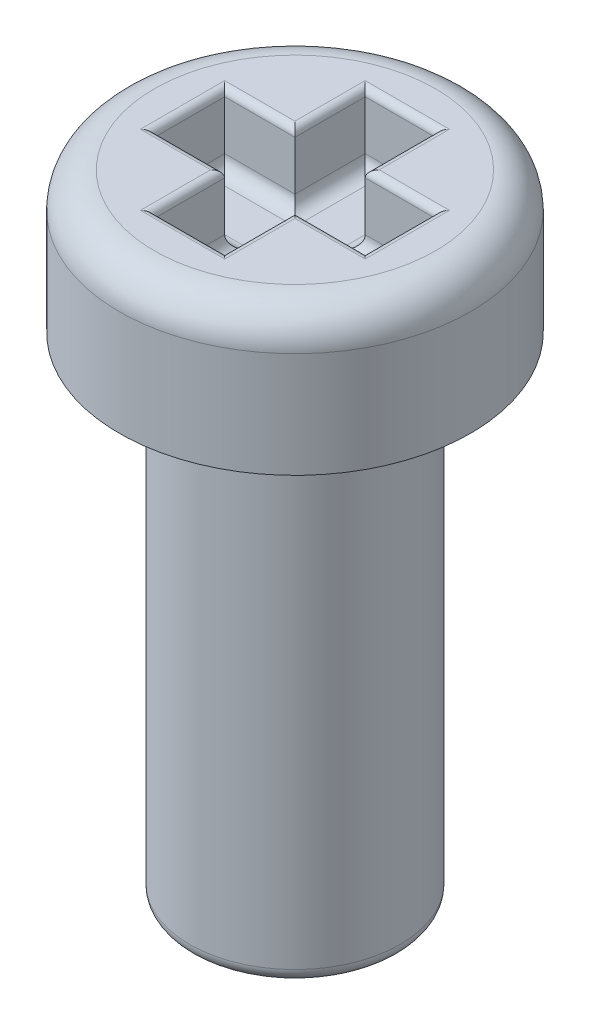
ISO-10303-21;
HEADER;
FILE_DESCRIPTION(('STEP AP214'),'2;1');
FILE_NAME('part.step','',(''),(''),'','','');
FILE_SCHEMA(('AUTOMOTIVE_DESIGN { 1 0 10303 214 1 1 1 1 }'));
ENDSEC;
DATA;
#1=APPLICATION_CONTEXT('core data for automotive mechanical design processes');
#2=APPLICATION_PROTOCOL_DEFINITION('international standard','automotive_design',2000,#1);
#3=PRODUCT_CONTEXT('',#1,'mechanical');
#4=PRODUCT('Part','Part','',(#3));
#5=PRODUCT_RELATED_PRODUCT_CATEGORY('part','',(#4));
#6=PRODUCT_DEFINITION_FORMATION('','',#4);
#7=PRODUCT_DEFINITION_CONTEXT('part definition',#1,'design');
#8=PRODUCT_DEFINITION('design','',#6,#7);
#9=PRODUCT_DEFINITION_SHAPE('','',#8);
#10=(LENGTH_UNIT() NAMED_UNIT(*) SI_UNIT(.MILLI.,.METRE.));
#11=(NAMED_UNIT(*) PLANE_ANGLE_UNIT() SI_UNIT($,.RADIAN.));
#12=(NAMED_UNIT(*) SI_UNIT($,.STERADIAN.) SOLID_ANGLE_UNIT());
#13=UNCERTAINTY_MEASURE_WITH_UNIT(LENGTH_MEASURE(1.E-05),#10,'distance_accuracy_value','');
#14=(GEOMETRIC_REPRESENTATION_CONTEXT(3) GLOBAL_UNCERTAINTY_ASSIGNED_CONTEXT((#13)) GLOBAL_UNIT_ASSIGNED_CONTEXT((#10,
#11,#12)) REPRESENTATION_CONTEXT('',''));
#15=CARTESIAN_POINT('',(0.,0.,0.));
#16=DIRECTION('',(0.,0.,1.));
#17=DIRECTION('',(1.,0.,0.));
#18=AXIS2_PLACEMENT_3D('',#15,#16,#17);
#19=CARTESIAN_POINT('',(0.,7.,0.));
#20=DIRECTION('',(0.,-1.,0.));
#21=DIRECTION('',(0.,0.,-1.));
#22=AXIS2_PLACEMENT_3D('',#19,#20,#21);
#23=CYLINDRICAL_SURFACE('',#22,1.5);
#24=CARTESIAN_POINT('',(0.,0.2,0.));
#25=DIRECTION('',(0.,1.,0.));
#26=DIRECTION('',(0.,0.,1.));
#27=AXIS2_PLACEMENT_3D('',#24,#25,#26);
#28=CIRCLE('',#27,1.5);
#29=CARTESIAN_POINT('',(0.,0.2,1.5));
#30=VERTEX_POINT('',#29);
#31=EDGE_CURVE('E245',#30,#30,#28,.T.);
#32=ORIENTED_EDGE('',*,*,#31,.T.);
#33=EDGE_LOOP('',(#32));
#34=FACE_BOUND('',#33,.T.);
#35=CARTESIAN_POINT('',(0.,7.,0.));
#36=DIRECTION('',(0.,1.,0.));
#37=DIRECTION('',(0.,0.,1.));
#38=AXIS2_PLACEMENT_3D('',#35,#36,#37);
#39=CIRCLE('',#38,1.5);
#40=CARTESIAN_POINT('',(0.,7.,1.5));
#41=VERTEX_POINT('',#40);
#42=EDGE_CURVE('E549',#41,#41,#39,.T.);
#43=ORIENTED_EDGE('',*,*,#42,.F.);
#44=EDGE_LOOP('',(#43));
#45=FACE_BOUND('',#44,.T.);
#46=ADVANCED_FACE('F39',(#34,#45),#23,.T.);
#47=CARTESIAN_POINT('',(0.,0.,0.));
#48=DIRECTION('',(0.,1.,0.));
#49=DIRECTION('',(0.,0.,1.));
#50=AXIS2_PLACEMENT_3D('',#47,#48,#49);
#51=PLANE('',#50);
#52=CARTESIAN_POINT('',(0.,0.,0.));
#53=DIRECTION('',(0.,1.,0.));
#54=DIRECTION('',(0.,0.,1.));
#55=AXIS2_PLACEMENT_3D('',#52,#53,#54);
#56=CIRCLE('',#55,1.3);
#57=CARTESIAN_POINT('',(0.,0.,1.3));
#58=VERTEX_POINT('',#57);
#59=EDGE_CURVE('E240',#58,#58,#56,.F.);
#60=ORIENTED_EDGE('',*,*,#59,.T.);
#61=EDGE_LOOP('',(#60));
#62=FACE_BOUND('',#61,.T.);
#63=ADVANCED_FACE('F424',(#62),#51,.F.);
#64=CARTESIAN_POINT('',(0.,0.2,0.));
#65=DIRECTION('',(0.,1.,0.));
#66=DIRECTION('',(0.,0.,1.));
#67=AXIS2_PLACEMENT_3D('',#64,#65,#66);
#68=TOROIDAL_SURFACE('',#67,1.3,0.2);
#69=ORIENTED_EDGE('',*,*,#59,.F.);
#70=EDGE_LOOP('',(#69));
#71=FACE_BOUND('',#70,.T.);
#72=ORIENTED_EDGE('',*,*,#31,.F.);
#73=EDGE_LOOP('',(#72));
#74=FACE_BOUND('',#73,.T.);
#75=ADVANCED_FACE('F430',(#71,#74),#68,.T.);
#76=CARTESIAN_POINT('',(0.,7.,0.));
#77=DIRECTION('',(0.,1.,0.));
#78=DIRECTION('',(0.,0.,1.));
#79=AXIS2_PLACEMENT_3D('',#76,#77,#78);
#80=PLANE('',#79);
#81=ORIENTED_EDGE('',*,*,#42,.T.);
#82=EDGE_LOOP('',(#81));
#83=FACE_BOUND('',#82,.T.);
#84=CARTESIAN_POINT('',(0.,7.,0.));
#85=DIRECTION('',(0.,-1.,0.));
#86=DIRECTION('',(0.,0.,-1.));
#87=AXIS2_PLACEMENT_3D('',#84,#85,#86);
#88=CIRCLE('',#87,2.5);
#89=CARTESIAN_POINT('',(0.,7.,-2.5));
#90=VERTEX_POINT('',#89);
#91=EDGE_CURVE('E546',#90,#90,#88,.T.);
#92=ORIENTED_EDGE('',*,*,#91,.T.);
#93=EDGE_LOOP('',(#92));
#94=FACE_BOUND('',#93,.T.);
#95=ADVANCED_FACE('F439',(#83,#94),#80,.F.);
#96=CARTESIAN_POINT('',(0.,0.,0.));
#97=DIRECTION('',(0.,-1.,0.));
#98=DIRECTION('',(0.,0.,-1.));
#99=AXIS2_PLACEMENT_3D('',#96,#97,#98);
#100=CYLINDRICAL_SURFACE('',#99,2.5);
#101=CARTESIAN_POINT('',(0.,8.5,0.));
#102=DIRECTION('',(0.,-1.,0.));
#103=DIRECTION('',(0.,0.,-1.));
#104=AXIS2_PLACEMENT_3D('',#101,#102,#103);
#105=CIRCLE('',#104,2.5);
#106=CARTESIAN_POINT('',(0.,8.5,-2.5));
#107=VERTEX_POINT('',#106);
#108=EDGE_CURVE('E47',#107,#107,#105,.T.);
#109=ORIENTED_EDGE('',*,*,#108,.T.);
#110=EDGE_LOOP('',(#109));
#111=FACE_BOUND('',#110,.T.);
#112=ORIENTED_EDGE('',*,*,#91,.F.);
#113=EDGE_LOOP('',(#112));
#114=FACE_BOUND('',#113,.T.);
#115=ADVANCED_FACE('F409',(#111,#114),#100,.T.);
#116=CARTESIAN_POINT('',(-2.5,9.,0.));
#117=DIRECTION('',(0.,-1.,0.));
#118=DIRECTION('',(0.,0.,-1.));
#119=AXIS2_PLACEMENT_3D('',#116,#117,#118);
#120=PLANE('',#119);
#121=CARTESIAN_POINT('',(0.,9.,0.));
#122=DIRECTION('',(0.,-1.,0.));
#123=DIRECTION('',(0.,0.,-1.));
#124=AXIS2_PLACEMENT_3D('',#121,#122,#123);
#125=CIRCLE('',#124,2.);
#126=CARTESIAN_POINT('',(0.,9.,-2.));
#127=VERTEX_POINT('',#126);
#128=EDGE_CURVE('E11',#127,#127,#125,.F.);
#129=ORIENTED_EDGE('',*,*,#128,.T.);
#130=EDGE_LOOP('',(#129));
#131=FACE_BOUND('',#130,.T.);
#132=DIRECTION('',(0.,0.,1.));
#133=VECTOR('',#132,1.);
#134=CARTESIAN_POINT('',(-0.6,9.,0.));
#135=LINE('',#134,#133);
#136=CARTESIAN_POINT('',(-0.6,9.,1.6));
#137=VERTEX_POINT('',#136);
#138=CARTESIAN_POINT('',(-0.6,9.,0.6));
#139=VERTEX_POINT('',#138);
#140=EDGE_CURVE('E266',#137,#139,#135,.F.);
#141=ORIENTED_EDGE('',*,*,#140,.T.);
#142=DIRECTION('',(1.,0.,0.));
#143=VECTOR('',#142,1.);
#144=CARTESIAN_POINT('',(-2.5,9.,0.6));
#145=LINE('',#144,#143);
#146=CARTESIAN_POINT('',(-1.6,9.,0.6));
#147=VERTEX_POINT('',#146);
#148=EDGE_CURVE('E224',#139,#147,#145,.F.);
#149=ORIENTED_EDGE('',*,*,#148,.T.);
#150=DIRECTION('',(0.,0.,1.));
#151=VECTOR('',#150,1.);
#152=CARTESIAN_POINT('',(-1.6,9.,0.));
#153=LINE('',#152,#151);
#154=CARTESIAN_POINT('',(-1.6,9.,-0.6));
#155=VERTEX_POINT('',#154);
#156=EDGE_CURVE('E239',#147,#155,#153,.F.);
#157=ORIENTED_EDGE('',*,*,#156,.T.);
#158=DIRECTION('',(-1.,0.,0.));
#159=VECTOR('',#158,1.);
#160=CARTESIAN_POINT('',(-2.5,9.,-0.6));
#161=LINE('',#160,#159);
#162=CARTESIAN_POINT('',(-0.6,9.,-0.6));
#163=VERTEX_POINT('',#162);
#164=EDGE_CURVE('E242',#155,#163,#161,.F.);
#165=ORIENTED_EDGE('',*,*,#164,.T.);
#166=DIRECTION('',(0.,0.,1.));
#167=VECTOR('',#166,1.);
#168=CARTESIAN_POINT('',(-0.6,9.,0.));
#169=LINE('',#168,#167);
#170=CARTESIAN_POINT('',(-0.6,9.,-1.6));
#171=VERTEX_POINT('',#170);
#172=EDGE_CURVE('E250',#163,#171,#169,.F.);
#173=ORIENTED_EDGE('',*,*,#172,.T.);
#174=DIRECTION('',(-1.,0.,0.));
#175=VECTOR('',#174,1.);
#176=CARTESIAN_POINT('',(-2.5,9.,-1.6));
#177=LINE('',#176,#175);
#178=CARTESIAN_POINT('',(0.6,9.,-1.6));
#179=VERTEX_POINT('',#178);
#180=EDGE_CURVE('E252',#171,#179,#177,.F.);
#181=ORIENTED_EDGE('',*,*,#180,.T.);
#182=DIRECTION('',(0.,0.,-1.));
#183=VECTOR('',#182,1.);
#184=CARTESIAN_POINT('',(0.6,9.,0.));
#185=LINE('',#184,#183);
#186=CARTESIAN_POINT('',(0.6,9.,-0.6));
#187=VERTEX_POINT('',#186);
#188=EDGE_CURVE('E254',#179,#187,#185,.F.);
#189=ORIENTED_EDGE('',*,*,#188,.T.);
#190=DIRECTION('',(-1.,0.,0.));
#191=VECTOR('',#190,1.);
#192=CARTESIAN_POINT('',(-2.5,9.,-0.599999999999999));
#193=LINE('',#192,#191);
#194=CARTESIAN_POINT('',(1.6,9.,-0.6));
#195=VERTEX_POINT('',#194);
#196=EDGE_CURVE('E256',#187,#195,#193,.F.);
#197=ORIENTED_EDGE('',*,*,#196,.T.);
#198=DIRECTION('',(0.,0.,-1.));
#199=VECTOR('',#198,1.);
#200=CARTESIAN_POINT('',(1.6,9.,0.));
#201=LINE('',#200,#199);
#202=CARTESIAN_POINT('',(1.6,9.,0.6));
#203=VERTEX_POINT('',#202);
#204=EDGE_CURVE('E258',#195,#203,#201,.F.);
#205=ORIENTED_EDGE('',*,*,#204,.T.);
#206=DIRECTION('',(1.,0.,0.));
#207=VECTOR('',#206,1.);
#208=CARTESIAN_POINT('',(-2.5,9.,0.6));
#209=LINE('',#208,#207);
#210=CARTESIAN_POINT('',(0.6,9.,0.6));
#211=VERTEX_POINT('',#210);
#212=EDGE_CURVE('E260',#203,#211,#209,.F.);
#213=ORIENTED_EDGE('',*,*,#212,.T.);
#214=DIRECTION('',(0.,0.,-1.));
#215=VECTOR('',#214,1.);
#216=CARTESIAN_POINT('',(0.6,9.,0.));
#217=LINE('',#216,#215);
#218=CARTESIAN_POINT('',(0.6,9.,1.6));
#219=VERTEX_POINT('',#218);
#220=EDGE_CURVE('E262',#211,#219,#217,.F.);
#221=ORIENTED_EDGE('',*,*,#220,.T.);
#222=DIRECTION('',(1.,0.,0.));
#223=VECTOR('',#222,1.);
#224=CARTESIAN_POINT('',(-2.5,9.,1.6));
#225=LINE('',#224,#223);
#226=EDGE_CURVE('E264',#219,#137,#225,.F.);
#227=ORIENTED_EDGE('',*,*,#226,.T.);
#228=EDGE_LOOP('',(#141,#149,#157,#165,#173,#181,#189,#197,#205,#213,#221,#227));
#229=FACE_BOUND('',#228,.T.);
#230=ADVANCED_FACE('F578',(#131,#229),#120,.F.);
#231=CARTESIAN_POINT('',(0.5,8.,0.5));
#232=DIRECTION('',(1.,0.,0.));
#233=DIRECTION('',(0.,0.,-1.));
#234=AXIS2_PLACEMENT_3D('',#231,#232,#233);
#235=PLANE('',#234);
#236=DIRECTION('',(0.,1.,0.));
#237=VECTOR('',#236,1.);
#238=CARTESIAN_POINT('',(0.5,8.,0.5));
#239=LINE('',#238,#237);
#240=CARTESIAN_POINT('',(0.5,8.2,0.5));
#241=VERTEX_POINT('',#240);
#242=CARTESIAN_POINT('',(0.5,8.9,0.5));
#243=VERTEX_POINT('',#242);
#244=EDGE_CURVE('E327',#241,#243,#239,.T.);
#245=ORIENTED_EDGE('',*,*,#244,.F.);
#246=DIRECTION('',(0.,0.,-1.));
#247=VECTOR('',#246,1.);
#248=CARTESIAN_POINT('',(0.5,8.2,0.5));
#249=LINE('',#248,#247);
#250=CARTESIAN_POINT('',(0.5,8.2,1.5));
#251=VERTEX_POINT('',#250);
#252=EDGE_CURVE('E360',#241,#251,#249,.F.);
#253=ORIENTED_EDGE('',*,*,#252,.T.);
#254=DIRECTION('',(0.,1.,0.));
#255=VECTOR('',#254,1.);
#256=CARTESIAN_POINT('',(0.5,8.,1.5));
#257=LINE('',#256,#255);
#258=CARTESIAN_POINT('',(0.5,8.9,1.5));
#259=VERTEX_POINT('',#258);
#260=EDGE_CURVE('E542',#251,#259,#257,.T.);
#261=ORIENTED_EDGE('',*,*,#260,.T.);
#262=DIRECTION('',(0.,0.,-1.));
#263=VECTOR('',#262,1.);
#264=CARTESIAN_POINT('',(0.5,8.9,0.5));
#265=LINE('',#264,#263);
#266=EDGE_CURVE('E271',#259,#243,#265,.T.);
#267=ORIENTED_EDGE('',*,*,#266,.T.);
#268=EDGE_LOOP('',(#245,#253,#261,#267));
#269=FACE_BOUND('',#268,.T.);
#270=ADVANCED_FACE('F541',(#269),#235,.F.);
#271=CARTESIAN_POINT('',(-0.5,8.,1.5));
#272=DIRECTION('',(0.,0.,1.));
#273=DIRECTION('',(1.,0.,0.));
#274=AXIS2_PLACEMENT_3D('',#271,#272,#273);
#275=PLANE('',#274);
#276=ORIENTED_EDGE('',*,*,#260,.F.);
#277=DIRECTION('',(1.,0.,0.));
#278=VECTOR('',#277,1.);
#279=CARTESIAN_POINT('',(-0.5,8.2,1.5));
#280=LINE('',#279,#278);
#281=CARTESIAN_POINT('',(-0.5,8.2,1.5));
#282=VERTEX_POINT('',#281);
#283=EDGE_CURVE('E362',#251,#282,#280,.F.);
#284=ORIENTED_EDGE('',*,*,#283,.T.);
#285=DIRECTION('',(0.,1.,0.));
#286=VECTOR('',#285,1.);
#287=CARTESIAN_POINT('',(-0.5,8.,1.5));
#288=LINE('',#287,#286);
#289=CARTESIAN_POINT('',(-0.5,8.9,1.5));
#290=VERTEX_POINT('',#289);
#291=EDGE_CURVE('E213',#282,#290,#288,.T.);
#292=ORIENTED_EDGE('',*,*,#291,.T.);
#293=DIRECTION('',(1.,0.,0.));
#294=VECTOR('',#293,1.);
#295=CARTESIAN_POINT('',(-0.5,8.9,1.5));
#296=LINE('',#295,#294);
#297=EDGE_CURVE('E234',#290,#259,#296,.T.);
#298=ORIENTED_EDGE('',*,*,#297,.T.);
#299=EDGE_LOOP('',(#276,#284,#292,#298));
#300=FACE_BOUND('',#299,.T.);
#301=ADVANCED_FACE('F544',(#300),#275,.F.);
#302=CARTESIAN_POINT('',(-0.5,8.,0.5));
#303=DIRECTION('',(-1.,0.,0.));
#304=DIRECTION('',(0.,0.,1.));
#305=AXIS2_PLACEMENT_3D('',#302,#303,#304);
#306=PLANE('',#305);
#307=ORIENTED_EDGE('',*,*,#291,.F.);
#308=DIRECTION('',(0.,0.,1.));
#309=VECTOR('',#308,1.);
#310=CARTESIAN_POINT('',(-0.5,8.2,0.5));
#311=LINE('',#310,#309);
#312=CARTESIAN_POINT('',(-0.5,8.2,0.5));
#313=VERTEX_POINT('',#312);
#314=EDGE_CURVE('E209',#282,#313,#311,.F.);
#315=ORIENTED_EDGE('',*,*,#314,.T.);
#316=DIRECTION('',(0.,1.,0.));
#317=VECTOR('',#316,1.);
#318=CARTESIAN_POINT('',(-0.5,8.,0.5));
#319=LINE('',#318,#317);
#320=CARTESIAN_POINT('',(-0.5,8.9,0.5));
#321=VERTEX_POINT('',#320);
#322=EDGE_CURVE('E201',#313,#321,#319,.T.);
#323=ORIENTED_EDGE('',*,*,#322,.T.);
#324=DIRECTION('',(0.,0.,1.));
#325=VECTOR('',#324,1.);
#326=CARTESIAN_POINT('',(-0.5,8.9,0.5));
#327=LINE('',#326,#325);
#328=EDGE_CURVE('E206',#321,#290,#327,.T.);
#329=ORIENTED_EDGE('',*,*,#328,.T.);
#330=EDGE_LOOP('',(#307,#315,#323,#329));
#331=FACE_BOUND('',#330,.T.);
#332=ADVANCED_FACE('F204',(#331),#306,.F.);
#333=CARTESIAN_POINT('',(-0.5,8.,0.5));
#334=DIRECTION('',(0.,0.,1.));
#335=DIRECTION('',(1.,0.,0.));
#336=AXIS2_PLACEMENT_3D('',#333,#334,#335);
#337=PLANE('',#336);
#338=ORIENTED_EDGE('',*,*,#322,.F.);
#339=DIRECTION('',(1.,0.,0.));
#340=VECTOR('',#339,1.);
#341=CARTESIAN_POINT('',(-0.5,8.2,0.5));
#342=LINE('',#341,#340);
#343=CARTESIAN_POINT('',(-1.5,8.2,0.5));
#344=VERTEX_POINT('',#343);
#345=EDGE_CURVE('E357',#313,#344,#342,.F.);
#346=ORIENTED_EDGE('',*,*,#345,.T.);
#347=DIRECTION('',(0.,1.,0.));
#348=VECTOR('',#347,1.);
#349=CARTESIAN_POINT('',(-1.5,8.,0.5));
#350=LINE('',#349,#348);
#351=CARTESIAN_POINT('',(-1.5,8.9,0.5));
#352=VERTEX_POINT('',#351);
#353=EDGE_CURVE('E214',#344,#352,#350,.T.);
#354=ORIENTED_EDGE('',*,*,#353,.T.);
#355=DIRECTION('',(1.,0.,0.));
#356=VECTOR('',#355,1.);
#357=CARTESIAN_POINT('',(-0.5,8.9,0.5));
#358=LINE('',#357,#356);
#359=EDGE_CURVE('E222',#352,#321,#358,.T.);
#360=ORIENTED_EDGE('',*,*,#359,.T.);
#361=EDGE_LOOP('',(#338,#346,#354,#360));
#362=FACE_BOUND('',#361,.T.);
#363=ADVANCED_FACE('F236',(#362),#337,.F.);
#364=CARTESIAN_POINT('',(-1.5,8.,-0.5));
#365=DIRECTION('',(-1.,0.,0.));
#366=DIRECTION('',(0.,0.,1.));
#367=AXIS2_PLACEMENT_3D('',#364,#365,#366);
#368=PLANE('',#367);
#369=ORIENTED_EDGE('',*,*,#353,.F.);
#370=DIRECTION('',(0.,0.,1.));
#371=VECTOR('',#370,1.);
#372=CARTESIAN_POINT('',(-1.5,8.2,-0.5));
#373=LINE('',#372,#371);
#374=CARTESIAN_POINT('',(-1.5,8.2,-0.5));
#375=VERTEX_POINT('',#374);
#376=EDGE_CURVE('E355',#344,#375,#373,.F.);
#377=ORIENTED_EDGE('',*,*,#376,.T.);
#378=DIRECTION('',(0.,1.,0.));
#379=VECTOR('',#378,1.);
#380=CARTESIAN_POINT('',(-1.5,8.,-0.5));
#381=LINE('',#380,#379);
#382=CARTESIAN_POINT('',(-1.5,8.9,-0.5));
#383=VERTEX_POINT('',#382);
#384=EDGE_CURVE('E554',#375,#383,#381,.T.);
#385=ORIENTED_EDGE('',*,*,#384,.T.);
#386=DIRECTION('',(0.,0.,1.));
#387=VECTOR('',#386,1.);
#388=CARTESIAN_POINT('',(-1.5,8.9,-0.5));
#389=LINE('',#388,#387);
#390=EDGE_CURVE('E295',#383,#352,#389,.T.);
#391=ORIENTED_EDGE('',*,*,#390,.T.);
#392=EDGE_LOOP('',(#369,#377,#385,#391));
#393=FACE_BOUND('',#392,.T.);
#394=ADVANCED_FACE('F612',(#393),#368,.F.);
#395=CARTESIAN_POINT('',(-0.5,8.,-0.5));
#396=DIRECTION('',(0.,0.,-1.));
#397=DIRECTION('',(-1.,0.,0.));
#398=AXIS2_PLACEMENT_3D('',#395,#396,#397);
#399=PLANE('',#398);
#400=ORIENTED_EDGE('',*,*,#384,.F.);
#401=DIRECTION('',(-1.,0.,0.));
#402=VECTOR('',#401,1.);
#403=CARTESIAN_POINT('',(-0.5,8.2,-0.5));
#404=LINE('',#403,#402);
#405=CARTESIAN_POINT('',(-0.5,8.2,-0.5));
#406=VERTEX_POINT('',#405);
#407=EDGE_CURVE('E352',#375,#406,#404,.F.);
#408=ORIENTED_EDGE('',*,*,#407,.T.);
#409=DIRECTION('',(0.,1.,0.));
#410=VECTOR('',#409,1.);
#411=CARTESIAN_POINT('',(-0.5,8.,-0.5));
#412=LINE('',#411,#410);
#413=CARTESIAN_POINT('',(-0.5,8.9,-0.5));
#414=VERTEX_POINT('',#413);
#415=EDGE_CURVE('E556',#406,#414,#412,.T.);
#416=ORIENTED_EDGE('',*,*,#415,.T.);
#417=DIRECTION('',(-1.,0.,0.));
#418=VECTOR('',#417,1.);
#419=CARTESIAN_POINT('',(-0.5,8.9,-0.5));
#420=LINE('',#419,#418);
#421=EDGE_CURVE('E292',#414,#383,#420,.T.);
#422=ORIENTED_EDGE('',*,*,#421,.T.);
#423=EDGE_LOOP('',(#400,#408,#416,#422));
#424=FACE_BOUND('',#423,.T.);
#425=ADVANCED_FACE('F609',(#424),#399,.F.);
#426=CARTESIAN_POINT('',(-0.5,8.,-1.5));
#427=DIRECTION('',(-1.,0.,0.));
#428=DIRECTION('',(0.,0.,1.));
#429=AXIS2_PLACEMENT_3D('',#426,#427,#428);
#430=PLANE('',#429);
#431=ORIENTED_EDGE('',*,*,#415,.F.);
#432=DIRECTION('',(0.,0.,1.));
#433=VECTOR('',#432,1.);
#434=CARTESIAN_POINT('',(-0.5,8.2,-1.5));
#435=LINE('',#434,#433);
#436=CARTESIAN_POINT('',(-0.5,8.2,-1.5));
#437=VERTEX_POINT('',#436);
#438=EDGE_CURVE('E54',#406,#437,#435,.F.);
#439=ORIENTED_EDGE('',*,*,#438,.T.);
#440=DIRECTION('',(0.,1.,0.));
#441=VECTOR('',#440,1.);
#442=CARTESIAN_POINT('',(-0.5,8.,-1.5));
#443=LINE('',#442,#441);
#444=CARTESIAN_POINT('',(-0.5,8.9,-1.5));
#445=VERTEX_POINT('',#444);
#446=EDGE_CURVE('E558',#437,#445,#443,.T.);
#447=ORIENTED_EDGE('',*,*,#446,.T.);
#448=DIRECTION('',(0.,0.,1.));
#449=VECTOR('',#448,1.);
#450=CARTESIAN_POINT('',(-0.5,8.9,-1.5));
#451=LINE('',#450,#449);
#452=EDGE_CURVE('E289',#445,#414,#451,.T.);
#453=ORIENTED_EDGE('',*,*,#452,.T.);
#454=EDGE_LOOP('',(#431,#439,#447,#453));
#455=FACE_BOUND('',#454,.T.);
#456=ADVANCED_FACE('F606',(#455),#430,.F.);
#457=CARTESIAN_POINT('',(-0.5,8.,-1.5));
#458=DIRECTION('',(0.,0.,-1.));
#459=DIRECTION('',(-1.,0.,0.));
#460=AXIS2_PLACEMENT_3D('',#457,#458,#459);
#461=PLANE('',#460);
#462=ORIENTED_EDGE('',*,*,#446,.F.);
#463=DIRECTION('',(-1.,0.,0.));
#464=VECTOR('',#463,1.);
#465=CARTESIAN_POINT('',(-0.5,8.2,-1.5));
#466=LINE('',#465,#464);
#467=CARTESIAN_POINT('',(0.5,8.2,-1.5));
#468=VERTEX_POINT('',#467);
#469=EDGE_CURVE('E61',#437,#468,#466,.F.);
#470=ORIENTED_EDGE('',*,*,#469,.T.);
#471=DIRECTION('',(0.,1.,0.));
#472=VECTOR('',#471,1.);
#473=CARTESIAN_POINT('',(0.5,8.,-1.5));
#474=LINE('',#473,#472);
#475=CARTESIAN_POINT('',(0.5,8.9,-1.5));
#476=VERTEX_POINT('',#475);
#477=EDGE_CURVE('E560',#468,#476,#474,.T.);
#478=ORIENTED_EDGE('',*,*,#477,.T.);
#479=DIRECTION('',(-1.,0.,0.));
#480=VECTOR('',#479,1.);
#481=CARTESIAN_POINT('',(-0.5,8.9,-1.5));
#482=LINE('',#481,#480);
#483=EDGE_CURVE('E286',#476,#445,#482,.T.);
#484=ORIENTED_EDGE('',*,*,#483,.T.);
#485=EDGE_LOOP('',(#462,#470,#478,#484));
#486=FACE_BOUND('',#485,.T.);
#487=ADVANCED_FACE('F602',(#486),#461,.F.);
#488=CARTESIAN_POINT('',(0.5,8.,-1.5));
#489=DIRECTION('',(1.,0.,0.));
#490=DIRECTION('',(0.,0.,-1.));
#491=AXIS2_PLACEMENT_3D('',#488,#489,#490);
#492=PLANE('',#491);
#493=ORIENTED_EDGE('',*,*,#477,.F.);
#494=DIRECTION('',(0.,0.,-1.));
#495=VECTOR('',#494,1.);
#496=CARTESIAN_POINT('',(0.5,8.2,-1.5));
#497=LINE('',#496,#495);
#498=CARTESIAN_POINT('',(0.5,8.2,-0.5));
#499=VERTEX_POINT('',#498);
#500=EDGE_CURVE('E370',#468,#499,#497,.F.);
#501=ORIENTED_EDGE('',*,*,#500,.T.);
#502=DIRECTION('',(0.,1.,0.));
#503=VECTOR('',#502,1.);
#504=CARTESIAN_POINT('',(0.5,8.,-0.5));
#505=LINE('',#504,#503);
#506=CARTESIAN_POINT('',(0.5,8.9,-0.5));
#507=VERTEX_POINT('',#506);
#508=EDGE_CURVE('E562',#499,#507,#505,.T.);
#509=ORIENTED_EDGE('',*,*,#508,.T.);
#510=DIRECTION('',(0.,0.,-1.));
#511=VECTOR('',#510,1.);
#512=CARTESIAN_POINT('',(0.5,8.9,-1.5));
#513=LINE('',#512,#511);
#514=EDGE_CURVE('E283',#507,#476,#513,.T.);
#515=ORIENTED_EDGE('',*,*,#514,.T.);
#516=EDGE_LOOP('',(#493,#501,#509,#515));
#517=FACE_BOUND('',#516,.T.);
#518=ADVANCED_FACE('F598',(#517),#492,.F.);
#519=CARTESIAN_POINT('',(1.5,8.,-0.5));
#520=DIRECTION('',(0.,0.,-1.));
#521=DIRECTION('',(-1.,0.,0.));
#522=AXIS2_PLACEMENT_3D('',#519,#520,#521);
#523=PLANE('',#522);
#524=ORIENTED_EDGE('',*,*,#508,.F.);
#525=DIRECTION('',(-1.,0.,0.));
#526=VECTOR('',#525,1.);
#527=CARTESIAN_POINT('',(1.5,8.2,-0.5));
#528=LINE('',#527,#526);
#529=CARTESIAN_POINT('',(1.5,8.2,-0.5));
#530=VERTEX_POINT('',#529);
#531=EDGE_CURVE('E368',#499,#530,#528,.F.);
#532=ORIENTED_EDGE('',*,*,#531,.T.);
#533=DIRECTION('',(0.,1.,0.));
#534=VECTOR('',#533,1.);
#535=CARTESIAN_POINT('',(1.5,8.,-0.5));
#536=LINE('',#535,#534);
#537=CARTESIAN_POINT('',(1.5,8.9,-0.5));
#538=VERTEX_POINT('',#537);
#539=EDGE_CURVE('E564',#530,#538,#536,.T.);
#540=ORIENTED_EDGE('',*,*,#539,.T.);
#541=DIRECTION('',(-1.,0.,0.));
#542=VECTOR('',#541,1.);
#543=CARTESIAN_POINT('',(1.5,8.9,-0.5));
#544=LINE('',#543,#542);
#545=EDGE_CURVE('E280',#538,#507,#544,.T.);
#546=ORIENTED_EDGE('',*,*,#545,.T.);
#547=EDGE_LOOP('',(#524,#532,#540,#546));
#548=FACE_BOUND('',#547,.T.);
#549=ADVANCED_FACE('F594',(#548),#523,.F.);
#550=CARTESIAN_POINT('',(1.5,8.,-0.5));
#551=DIRECTION('',(1.,0.,0.));
#552=DIRECTION('',(0.,0.,-1.));
#553=AXIS2_PLACEMENT_3D('',#550,#551,#552);
#554=PLANE('',#553);
#555=ORIENTED_EDGE('',*,*,#539,.F.);
#556=DIRECTION('',(0.,0.,-1.));
#557=VECTOR('',#556,1.);
#558=CARTESIAN_POINT('',(1.5,8.2,-0.5));
#559=LINE('',#558,#557);
#560=CARTESIAN_POINT('',(1.5,8.2,0.5));
#561=VERTEX_POINT('',#560);
#562=EDGE_CURVE('E366',#530,#561,#559,.F.);
#563=ORIENTED_EDGE('',*,*,#562,.T.);
#564=DIRECTION('',(0.,1.,0.));
#565=VECTOR('',#564,1.);
#566=CARTESIAN_POINT('',(1.5,8.,0.5));
#567=LINE('',#566,#565);
#568=CARTESIAN_POINT('',(1.5,8.9,0.5));
#569=VERTEX_POINT('',#568);
#570=EDGE_CURVE('E566',#561,#569,#567,.T.);
#571=ORIENTED_EDGE('',*,*,#570,.T.);
#572=DIRECTION('',(0.,0.,-1.));
#573=VECTOR('',#572,1.);
#574=CARTESIAN_POINT('',(1.5,8.9,-0.5));
#575=LINE('',#574,#573);
#576=EDGE_CURVE('E277',#569,#538,#575,.T.);
#577=ORIENTED_EDGE('',*,*,#576,.T.);
#578=EDGE_LOOP('',(#555,#563,#571,#577));
#579=FACE_BOUND('',#578,.T.);
#580=ADVANCED_FACE('F590',(#579),#554,.F.);
#581=CARTESIAN_POINT('',(1.5,8.,0.5));
#582=DIRECTION('',(0.,0.,1.));
#583=DIRECTION('',(1.,0.,0.));
#584=AXIS2_PLACEMENT_3D('',#581,#582,#583);
#585=PLANE('',#584);
#586=ORIENTED_EDGE('',*,*,#570,.F.);
#587=DIRECTION('',(1.,0.,0.));
#588=VECTOR('',#587,1.);
#589=CARTESIAN_POINT('',(1.5,8.2,0.5));
#590=LINE('',#589,#588);
#591=EDGE_CURVE('E364',#561,#241,#590,.F.);
#592=ORIENTED_EDGE('',*,*,#591,.T.);
#593=ORIENTED_EDGE('',*,*,#244,.T.);
#594=DIRECTION('',(1.,0.,0.));
#595=VECTOR('',#594,1.);
#596=CARTESIAN_POINT('',(1.5,8.9,0.5));
#597=LINE('',#596,#595);
#598=EDGE_CURVE('E274',#243,#569,#597,.T.);
#599=ORIENTED_EDGE('',*,*,#598,.T.);
#600=EDGE_LOOP('',(#586,#592,#593,#599));
#601=FACE_BOUND('',#600,.T.);
#602=ADVANCED_FACE('F587',(#601),#585,.F.);
#603=CARTESIAN_POINT('',(0.,8.,0.));
#604=DIRECTION('',(0.,1.,0.));
#605=DIRECTION('',(0.,0.,1.));
#606=AXIS2_PLACEMENT_3D('',#603,#604,#605);
#607=PLANE('',#606);
#608=DIRECTION('',(-1.,0.,0.));
#609=VECTOR('',#608,1.);
#610=CARTESIAN_POINT('',(0.,8.,-0.3));
#611=LINE('',#610,#609);
#612=CARTESIAN_POINT('',(-0.3,8.,-0.3));
#613=VERTEX_POINT('',#612);
#614=CARTESIAN_POINT('',(-1.3,8.,-0.3));
#615=VERTEX_POINT('',#614);
#616=EDGE_CURVE('E341',#613,#615,#611,.T.);
#617=ORIENTED_EDGE('',*,*,#616,.T.);
#618=DIRECTION('',(0.,0.,1.));
#619=VECTOR('',#618,1.);
#620=CARTESIAN_POINT('',(-1.3,8.,0.));
#621=LINE('',#620,#619);
#622=CARTESIAN_POINT('',(-1.3,8.,0.3));
#623=VERTEX_POINT('',#622);
#624=EDGE_CURVE('E350',#615,#623,#621,.T.);
#625=ORIENTED_EDGE('',*,*,#624,.T.);
#626=DIRECTION('',(1.,0.,0.));
#627=VECTOR('',#626,1.);
#628=CARTESIAN_POINT('',(0.,8.,0.3));
#629=LINE('',#628,#627);
#630=CARTESIAN_POINT('',(-0.3,8.,0.3));
#631=VERTEX_POINT('',#630);
#632=EDGE_CURVE('E348',#623,#631,#629,.T.);
#633=ORIENTED_EDGE('',*,*,#632,.T.);
#634=DIRECTION('',(0.,0.,1.));
#635=VECTOR('',#634,1.);
#636=CARTESIAN_POINT('',(-0.3,8.,0.));
#637=LINE('',#636,#635);
#638=CARTESIAN_POINT('',(-0.3,8.,1.3));
#639=VERTEX_POINT('',#638);
#640=EDGE_CURVE('E346',#631,#639,#637,.T.);
#641=ORIENTED_EDGE('',*,*,#640,.T.);
#642=DIRECTION('',(1.,0.,0.));
#643=VECTOR('',#642,1.);
#644=CARTESIAN_POINT('',(0.,8.,1.3));
#645=LINE('',#644,#643);
#646=CARTESIAN_POINT('',(0.3,8.,1.3));
#647=VERTEX_POINT('',#646);
#648=EDGE_CURVE('E344',#639,#647,#645,.T.);
#649=ORIENTED_EDGE('',*,*,#648,.T.);
#650=DIRECTION('',(0.,0.,-1.));
#651=VECTOR('',#650,1.);
#652=CARTESIAN_POINT('',(0.3,8.,0.));
#653=LINE('',#652,#651);
#654=CARTESIAN_POINT('',(0.3,8.,0.3));
#655=VERTEX_POINT('',#654);
#656=EDGE_CURVE('E339',#647,#655,#653,.T.);
#657=ORIENTED_EDGE('',*,*,#656,.T.);
#658=DIRECTION('',(1.,0.,0.));
#659=VECTOR('',#658,1.);
#660=CARTESIAN_POINT('',(0.,8.,0.3));
#661=LINE('',#660,#659);
#662=CARTESIAN_POINT('',(1.3,8.,0.3));
#663=VERTEX_POINT('',#662);
#664=EDGE_CURVE('E337',#655,#663,#661,.T.);
#665=ORIENTED_EDGE('',*,*,#664,.T.);
#666=DIRECTION('',(0.,0.,-1.));
#667=VECTOR('',#666,1.);
#668=CARTESIAN_POINT('',(1.3,8.,0.));
#669=LINE('',#668,#667);
#670=CARTESIAN_POINT('',(1.3,8.,-0.3));
#671=VERTEX_POINT('',#670);
#672=EDGE_CURVE('E335',#663,#671,#669,.T.);
#673=ORIENTED_EDGE('',*,*,#672,.T.);
#674=DIRECTION('',(-1.,0.,0.));
#675=VECTOR('',#674,1.);
#676=CARTESIAN_POINT('',(0.,8.,-0.3));
#677=LINE('',#676,#675);
#678=CARTESIAN_POINT('',(0.3,8.,-0.3));
#679=VERTEX_POINT('',#678);
#680=EDGE_CURVE('E333',#671,#679,#677,.T.);
#681=ORIENTED_EDGE('',*,*,#680,.T.);
#682=DIRECTION('',(0.,0.,-1.));
#683=VECTOR('',#682,1.);
#684=CARTESIAN_POINT('',(0.3,8.,0.));
#685=LINE('',#684,#683);
#686=CARTESIAN_POINT('',(0.3,8.,-1.3));
#687=VERTEX_POINT('',#686);
#688=EDGE_CURVE('E331',#679,#687,#685,.T.);
#689=ORIENTED_EDGE('',*,*,#688,.T.);
#690=DIRECTION('',(-1.,0.,0.));
#691=VECTOR('',#690,1.);
#692=CARTESIAN_POINT('',(0.,8.,-1.3));
#693=LINE('',#692,#691);
#694=CARTESIAN_POINT('',(-0.3,8.,-1.3));
#695=VERTEX_POINT('',#694);
#696=EDGE_CURVE('E329',#687,#695,#693,.T.);
#697=ORIENTED_EDGE('',*,*,#696,.T.);
#698=DIRECTION('',(0.,0.,1.));
#699=VECTOR('',#698,1.);
#700=CARTESIAN_POINT('',(-0.3,8.,0.));
#701=LINE('',#700,#699);
#702=EDGE_CURVE('E296',#695,#613,#701,.T.);
#703=ORIENTED_EDGE('',*,*,#702,.T.);
#704=EDGE_LOOP('',(#617,#625,#633,#641,#649,#657,#665,#673,#681,#689,#697,#703));
#705=FACE_BOUND('',#704,.T.);
#706=ADVANCED_FACE('F484',(#705),#607,.T.);
#707=CARTESIAN_POINT('',(1.5,8.9,-0.6));
#708=DIRECTION('',(-1.,0.,0.));
#709=DIRECTION('',(0.,0.,1.));
#710=AXIS2_PLACEMENT_3D('',#707,#708,#709);
#711=CYLINDRICAL_SURFACE('',#710,0.1);
#712=CARTESIAN_POINT('',(1.6,8.9,-0.6));
#713=DIRECTION('',(-0.707106781186548,0.,-0.707106781186547));
#714=DIRECTION('',(0.707106781186547,0.,-0.707106781186548));
#715=AXIS2_PLACEMENT_3D('',#712,#713,#714);
#716=ELLIPSE('',#715,0.14142135623731,0.1);
#717=EDGE_CURVE('E321',#195,#538,#716,.F.);
#718=ORIENTED_EDGE('',*,*,#717,.F.);
#719=ORIENTED_EDGE('',*,*,#196,.F.);
#720=CARTESIAN_POINT('',(0.6,8.9,-0.6));
#721=DIRECTION('',(-0.707106781186548,0.,-0.707106781186547));
#722=DIRECTION('',(0.707106781186547,0.,-0.707106781186548));
#723=AXIS2_PLACEMENT_3D('',#720,#721,#722);
#724=ELLIPSE('',#723,0.14142135623731,0.1);
#725=EDGE_CURVE('E324',#507,#187,#724,.T.);
#726=ORIENTED_EDGE('',*,*,#725,.F.);
#727=ORIENTED_EDGE('',*,*,#545,.F.);
#728=EDGE_LOOP('',(#718,#719,#726,#727));
#729=FACE_BOUND('',#728,.T.);
#730=ADVANCED_FACE('F481',(#729),#711,.T.);
#731=CARTESIAN_POINT('',(0.6,8.9,-1.5));
#732=DIRECTION('',(0.,0.,-1.));
#733=DIRECTION('',(-1.,0.,0.));
#734=AXIS2_PLACEMENT_3D('',#731,#732,#733);
#735=CYLINDRICAL_SURFACE('',#734,0.1);
#736=ORIENTED_EDGE('',*,*,#725,.T.);
#737=ORIENTED_EDGE('',*,*,#188,.F.);
#738=CARTESIAN_POINT('',(0.6,8.9,-1.6));
#739=DIRECTION('',(-0.707106781186548,0.,-0.707106781186547));
#740=DIRECTION('',(0.707106781186547,0.,-0.707106781186548));
#741=AXIS2_PLACEMENT_3D('',#738,#739,#740);
#742=ELLIPSE('',#741,0.14142135623731,0.1);
#743=EDGE_CURVE('E318',#476,#179,#742,.T.);
#744=ORIENTED_EDGE('',*,*,#743,.F.);
#745=ORIENTED_EDGE('',*,*,#514,.F.);
#746=EDGE_LOOP('',(#736,#737,#744,#745));
#747=FACE_BOUND('',#746,.T.);
#748=ADVANCED_FACE('F477',(#747),#735,.T.);
#749=CARTESIAN_POINT('',(1.6,8.9,-0.5));
#750=DIRECTION('',(0.,0.,-1.));
#751=DIRECTION('',(-1.,0.,0.));
#752=AXIS2_PLACEMENT_3D('',#749,#750,#751);
#753=CYLINDRICAL_SURFACE('',#752,0.1);
#754=ORIENTED_EDGE('',*,*,#717,.T.);
#755=ORIENTED_EDGE('',*,*,#576,.F.);
#756=CARTESIAN_POINT('',(1.6,8.9,0.6));
#757=DIRECTION('',(0.707106781186547,0.,-0.707106781186547));
#758=DIRECTION('',(0.707106781186547,0.,0.707106781186547));
#759=AXIS2_PLACEMENT_3D('',#756,#757,#758);
#760=ELLIPSE('',#759,0.14142135623731,0.1);
#761=EDGE_CURVE('E315',#203,#569,#760,.F.);
#762=ORIENTED_EDGE('',*,*,#761,.F.);
#763=ORIENTED_EDGE('',*,*,#204,.F.);
#764=EDGE_LOOP('',(#754,#755,#762,#763));
#765=FACE_BOUND('',#764,.T.);
#766=ADVANCED_FACE('F473',(#765),#753,.T.);
#767=CARTESIAN_POINT('',(-0.5,8.9,-1.6));
#768=DIRECTION('',(-1.,0.,0.));
#769=DIRECTION('',(0.,0.,1.));
#770=AXIS2_PLACEMENT_3D('',#767,#768,#769);
#771=CYLINDRICAL_SURFACE('',#770,0.1);
#772=ORIENTED_EDGE('',*,*,#743,.T.);
#773=ORIENTED_EDGE('',*,*,#180,.F.);
#774=CARTESIAN_POINT('',(-0.6,8.9,-1.6));
#775=DIRECTION('',(-0.707106781186547,0.,0.707106781186547));
#776=DIRECTION('',(-0.707106781186547,0.,-0.707106781186547));
#777=AXIS2_PLACEMENT_3D('',#774,#775,#776);
#778=ELLIPSE('',#777,0.14142135623731,0.1);
#779=EDGE_CURVE('E312',#445,#171,#778,.T.);
#780=ORIENTED_EDGE('',*,*,#779,.F.);
#781=ORIENTED_EDGE('',*,*,#483,.F.);
#782=EDGE_LOOP('',(#772,#773,#780,#781));
#783=FACE_BOUND('',#782,.T.);
#784=ADVANCED_FACE('F469',(#783),#771,.T.);
#785=CARTESIAN_POINT('',(1.5,8.9,0.6));
#786=DIRECTION('',(1.,0.,0.));
#787=DIRECTION('',(0.,0.,-1.));
#788=AXIS2_PLACEMENT_3D('',#785,#786,#787);
#789=CYLINDRICAL_SURFACE('',#788,0.1);
#790=ORIENTED_EDGE('',*,*,#761,.T.);
#791=ORIENTED_EDGE('',*,*,#598,.F.);
#792=CARTESIAN_POINT('',(0.6,8.9,0.6));
#793=DIRECTION('',(0.707106781186547,0.,-0.707106781186547));
#794=DIRECTION('',(0.707106781186547,0.,0.707106781186547));
#795=AXIS2_PLACEMENT_3D('',#792,#793,#794);
#796=ELLIPSE('',#795,0.14142135623731,0.1);
#797=EDGE_CURVE('E309',#211,#243,#796,.F.);
#798=ORIENTED_EDGE('',*,*,#797,.F.);
#799=ORIENTED_EDGE('',*,*,#212,.F.);
#800=EDGE_LOOP('',(#790,#791,#798,#799));
#801=FACE_BOUND('',#800,.T.);
#802=ADVANCED_FACE('F465',(#801),#789,.T.);
#803=CARTESIAN_POINT('',(-0.6,8.9,-1.5));
#804=DIRECTION('',(0.,0.,1.));
#805=DIRECTION('',(1.,0.,0.));
#806=AXIS2_PLACEMENT_3D('',#803,#804,#805);
#807=CYLINDRICAL_SURFACE('',#806,0.1);
#808=ORIENTED_EDGE('',*,*,#779,.T.);
#809=ORIENTED_EDGE('',*,*,#172,.F.);
#810=CARTESIAN_POINT('',(-0.6,8.9,-0.6));
#811=DIRECTION('',(-0.707106781186548,0.,0.707106781186547));
#812=DIRECTION('',(-0.707106781186547,0.,-0.707106781186547));
#813=AXIS2_PLACEMENT_3D('',#810,#811,#812);
#814=ELLIPSE('',#813,0.14142135623731,0.1);
#815=EDGE_CURVE('E306',#414,#163,#814,.T.);
#816=ORIENTED_EDGE('',*,*,#815,.F.);
#817=ORIENTED_EDGE('',*,*,#452,.F.);
#818=EDGE_LOOP('',(#808,#809,#816,#817));
#819=FACE_BOUND('',#818,.T.);
#820=ADVANCED_FACE('F461',(#819),#807,.T.);
#821=CARTESIAN_POINT('',(0.6,8.9,0.5));
#822=DIRECTION('',(0.,0.,-1.));
#823=DIRECTION('',(-1.,0.,0.));
#824=AXIS2_PLACEMENT_3D('',#821,#822,#823);
#825=CYLINDRICAL_SURFACE('',#824,0.1);
#826=ORIENTED_EDGE('',*,*,#797,.T.);
#827=ORIENTED_EDGE('',*,*,#266,.F.);
#828=CARTESIAN_POINT('',(0.6,8.9,1.6));
#829=DIRECTION('',(0.707106781186547,0.,-0.707106781186547));
#830=DIRECTION('',(0.707106781186547,0.,0.707106781186547));
#831=AXIS2_PLACEMENT_3D('',#828,#829,#830);
#832=ELLIPSE('',#831,0.14142135623731,0.1);
#833=EDGE_CURVE('E303',#219,#259,#832,.F.);
#834=ORIENTED_EDGE('',*,*,#833,.F.);
#835=ORIENTED_EDGE('',*,*,#220,.F.);
#836=EDGE_LOOP('',(#826,#827,#834,#835));
#837=FACE_BOUND('',#836,.T.);
#838=ADVANCED_FACE('F457',(#837),#825,.T.);
#839=CARTESIAN_POINT('',(-0.5,8.9,-0.6));
#840=DIRECTION('',(-1.,0.,0.));
#841=DIRECTION('',(0.,0.,1.));
#842=AXIS2_PLACEMENT_3D('',#839,#840,#841);
#843=CYLINDRICAL_SURFACE('',#842,0.1);
#844=ORIENTED_EDGE('',*,*,#815,.T.);
#845=ORIENTED_EDGE('',*,*,#164,.F.);
#846=CARTESIAN_POINT('',(-1.6,8.9,-0.6));
#847=DIRECTION('',(-0.707106781186548,0.,0.707106781186547));
#848=DIRECTION('',(-0.707106781186547,0.,-0.707106781186547));
#849=AXIS2_PLACEMENT_3D('',#846,#847,#848);
#850=ELLIPSE('',#849,0.14142135623731,0.1);
#851=EDGE_CURVE('E300',#383,#155,#850,.T.);
#852=ORIENTED_EDGE('',*,*,#851,.F.);
#853=ORIENTED_EDGE('',*,*,#421,.F.);
#854=EDGE_LOOP('',(#844,#845,#852,#853));
#855=FACE_BOUND('',#854,.T.);
#856=ADVANCED_FACE('F453',(#855),#843,.T.);
#857=CARTESIAN_POINT('',(-0.5,8.9,1.6));
#858=DIRECTION('',(1.,0.,0.));
#859=DIRECTION('',(0.,0.,-1.));
#860=AXIS2_PLACEMENT_3D('',#857,#858,#859);
#861=CYLINDRICAL_SURFACE('',#860,0.1);
#862=ORIENTED_EDGE('',*,*,#833,.T.);
#863=ORIENTED_EDGE('',*,*,#297,.F.);
#864=CARTESIAN_POINT('',(-0.6,8.9,1.6));
#865=DIRECTION('',(0.707106781186547,0.,0.707106781186547));
#866=DIRECTION('',(-0.707106781186547,0.,0.707106781186547));
#867=AXIS2_PLACEMENT_3D('',#864,#865,#866);
#868=ELLIPSE('',#867,0.14142135623731,0.1);
#869=EDGE_CURVE('E233',#137,#290,#868,.F.);
#870=ORIENTED_EDGE('',*,*,#869,.F.);
#871=ORIENTED_EDGE('',*,*,#226,.F.);
#872=EDGE_LOOP('',(#862,#863,#870,#871));
#873=FACE_BOUND('',#872,.T.);
#874=ADVANCED_FACE('F449',(#873),#861,.T.);
#875=CARTESIAN_POINT('',(-1.6,8.9,-0.5));
#876=DIRECTION('',(0.,0.,1.));
#877=DIRECTION('',(1.,0.,0.));
#878=AXIS2_PLACEMENT_3D('',#875,#876,#877);
#879=CYLINDRICAL_SURFACE('',#878,0.1);
#880=ORIENTED_EDGE('',*,*,#851,.T.);
#881=ORIENTED_EDGE('',*,*,#156,.F.);
#882=CARTESIAN_POINT('',(-1.6,8.9,0.6));
#883=DIRECTION('',(0.707106781186547,0.,0.707106781186547));
#884=DIRECTION('',(0.707106781186547,0.,-0.707106781186547));
#885=AXIS2_PLACEMENT_3D('',#882,#883,#884);
#886=ELLIPSE('',#885,0.14142135623731,0.1);
#887=EDGE_CURVE('E227',#352,#147,#886,.T.);
#888=ORIENTED_EDGE('',*,*,#887,.F.);
#889=ORIENTED_EDGE('',*,*,#390,.F.);
#890=EDGE_LOOP('',(#880,#881,#888,#889));
#891=FACE_BOUND('',#890,.T.);
#892=ADVANCED_FACE('F446',(#891),#879,.T.);
#893=CARTESIAN_POINT('',(-0.6,8.9,0.5));
#894=DIRECTION('',(0.,0.,1.));
#895=DIRECTION('',(1.,0.,0.));
#896=AXIS2_PLACEMENT_3D('',#893,#894,#895);
#897=CYLINDRICAL_SURFACE('',#896,0.1);
#898=ORIENTED_EDGE('',*,*,#869,.T.);
#899=ORIENTED_EDGE('',*,*,#328,.F.);
#900=CARTESIAN_POINT('',(-0.6,8.9,0.6));
#901=DIRECTION('',(0.707106781186547,0.,0.707106781186547));
#902=DIRECTION('',(-0.707106781186547,0.,0.707106781186547));
#903=AXIS2_PLACEMENT_3D('',#900,#901,#902);
#904=ELLIPSE('',#903,0.14142135623731,0.1);
#905=EDGE_CURVE('E220',#139,#321,#904,.F.);
#906=ORIENTED_EDGE('',*,*,#905,.F.);
#907=ORIENTED_EDGE('',*,*,#140,.F.);
#908=EDGE_LOOP('',(#898,#899,#906,#907));
#909=FACE_BOUND('',#908,.T.);
#910=ADVANCED_FACE('F231',(#909),#897,.T.);
#911=CARTESIAN_POINT('',(-0.5,8.9,0.6));
#912=DIRECTION('',(1.,0.,0.));
#913=DIRECTION('',(0.,0.,-1.));
#914=AXIS2_PLACEMENT_3D('',#911,#912,#913);
#915=CYLINDRICAL_SURFACE('',#914,0.1);
#916=ORIENTED_EDGE('',*,*,#887,.T.);
#917=ORIENTED_EDGE('',*,*,#148,.F.);
#918=ORIENTED_EDGE('',*,*,#905,.T.);
#919=ORIENTED_EDGE('',*,*,#359,.F.);
#920=EDGE_LOOP('',(#916,#917,#918,#919));
#921=FACE_BOUND('',#920,.T.);
#922=ADVANCED_FACE('F221',(#921),#915,.T.);
#923=CARTESIAN_POINT('',(0.,8.2,0.3));
#924=DIRECTION('',(1.,0.,0.));
#925=DIRECTION('',(0.,0.,-1.));
#926=AXIS2_PLACEMENT_3D('',#923,#924,#925);
#927=CYLINDRICAL_SURFACE('',#926,0.2);
#928=CARTESIAN_POINT('',(0.3,8.2,0.3));
#929=DIRECTION('',(0.707106781186547,0.,-0.707106781186547));
#930=DIRECTION('',(0.707106781186547,0.,0.707106781186547));
#931=AXIS2_PLACEMENT_3D('',#928,#929,#930);
#932=ELLIPSE('',#931,0.282842712474619,0.2);
#933=EDGE_CURVE('E402',#241,#655,#932,.T.);
#934=ORIENTED_EDGE('',*,*,#933,.F.);
#935=ORIENTED_EDGE('',*,*,#591,.F.);
#936=CARTESIAN_POINT('',(1.3,8.2,0.3));
#937=DIRECTION('',(0.707106781186547,0.,-0.707106781186547));
#938=DIRECTION('',(0.707106781186547,0.,0.707106781186547));
#939=AXIS2_PLACEMENT_3D('',#936,#937,#938);
#940=ELLIPSE('',#939,0.282842712474619,0.2);
#941=EDGE_CURVE('E228',#663,#561,#940,.F.);
#942=ORIENTED_EDGE('',*,*,#941,.F.);
#943=ORIENTED_EDGE('',*,*,#664,.F.);
#944=EDGE_LOOP('',(#934,#935,#942,#943));
#945=FACE_BOUND('',#944,.T.);
#946=ADVANCED_FACE('F443',(#945),#927,.F.);
#947=CARTESIAN_POINT('',(1.3,8.2,0.));
#948=DIRECTION('',(0.,0.,-1.));
#949=DIRECTION('',(-1.,0.,0.));
#950=AXIS2_PLACEMENT_3D('',#947,#948,#949);
#951=CYLINDRICAL_SURFACE('',#950,0.2);
#952=ORIENTED_EDGE('',*,*,#941,.T.);
#953=ORIENTED_EDGE('',*,*,#562,.F.);
#954=CARTESIAN_POINT('',(1.3,8.2,-0.3));
#955=DIRECTION('',(-0.707106781186548,0.,-0.707106781186547));
#956=DIRECTION('',(0.707106781186547,0.,-0.707106781186548));
#957=AXIS2_PLACEMENT_3D('',#954,#955,#956);
#958=ELLIPSE('',#957,0.282842712474619,0.2);
#959=EDGE_CURVE('E399',#671,#530,#958,.F.);
#960=ORIENTED_EDGE('',*,*,#959,.F.);
#961=ORIENTED_EDGE('',*,*,#672,.F.);
#962=EDGE_LOOP('',(#952,#953,#960,#961));
#963=FACE_BOUND('',#962,.T.);
#964=ADVANCED_FACE('F521',(#963),#951,.F.);
#965=CARTESIAN_POINT('',(0.3,8.2,0.));
#966=DIRECTION('',(0.,0.,-1.));
#967=DIRECTION('',(-1.,0.,0.));
#968=AXIS2_PLACEMENT_3D('',#965,#966,#967);
#969=CYLINDRICAL_SURFACE('',#968,0.2);
#970=ORIENTED_EDGE('',*,*,#933,.T.);
#971=ORIENTED_EDGE('',*,*,#656,.F.);
#972=CARTESIAN_POINT('',(0.3,8.2,1.3));
#973=DIRECTION('',(0.707106781186547,0.,-0.707106781186547));
#974=DIRECTION('',(-0.707106781186547,0.,-0.707106781186547));
#975=AXIS2_PLACEMENT_3D('',#972,#973,#974);
#976=ELLIPSE('',#975,0.282842712474619,0.2);
#977=EDGE_CURVE('E396',#251,#647,#976,.T.);
#978=ORIENTED_EDGE('',*,*,#977,.F.);
#979=ORIENTED_EDGE('',*,*,#252,.F.);
#980=EDGE_LOOP('',(#970,#971,#978,#979));
#981=FACE_BOUND('',#980,.T.);
#982=ADVANCED_FACE('F517',(#981),#969,.F.);
#983=CARTESIAN_POINT('',(0.,8.2,-0.3));
#984=DIRECTION('',(-1.,0.,0.));
#985=DIRECTION('',(0.,0.,1.));
#986=AXIS2_PLACEMENT_3D('',#983,#984,#985);
#987=CYLINDRICAL_SURFACE('',#986,0.2);
#988=ORIENTED_EDGE('',*,*,#959,.T.);
#989=ORIENTED_EDGE('',*,*,#531,.F.);
#990=CARTESIAN_POINT('',(0.3,8.2,-0.3));
#991=DIRECTION('',(-0.707106781186548,0.,-0.707106781186547));
#992=DIRECTION('',(0.707106781186547,0.,-0.707106781186548));
#993=AXIS2_PLACEMENT_3D('',#990,#991,#992);
#994=ELLIPSE('',#993,0.282842712474619,0.2);
#995=EDGE_CURVE('E393',#679,#499,#994,.F.);
#996=ORIENTED_EDGE('',*,*,#995,.F.);
#997=ORIENTED_EDGE('',*,*,#680,.F.);
#998=EDGE_LOOP('',(#988,#989,#996,#997));
#999=FACE_BOUND('',#998,.T.);
#1000=ADVANCED_FACE('F513',(#999),#987,.F.);
#1001=CARTESIAN_POINT('',(0.,8.2,1.3));
#1002=DIRECTION('',(1.,0.,0.));
#1003=DIRECTION('',(0.,0.,-1.));
#1004=AXIS2_PLACEMENT_3D('',#1001,#1002,#1003);
#1005=CYLINDRICAL_SURFACE('',#1004,0.2);
#1006=ORIENTED_EDGE('',*,*,#977,.T.);
#1007=ORIENTED_EDGE('',*,*,#648,.F.);
#1008=CARTESIAN_POINT('',(-0.3,8.2,1.3));
#1009=DIRECTION('',(0.707106781186547,0.,0.707106781186547));
#1010=DIRECTION('',(-0.707106781186547,0.,0.707106781186547));
#1011=AXIS2_PLACEMENT_3D('',#1008,#1009,#1010);
#1012=ELLIPSE('',#1011,0.282842712474619,0.2);
#1013=EDGE_CURVE('E390',#282,#639,#1012,.T.);
#1014=ORIENTED_EDGE('',*,*,#1013,.F.);
#1015=ORIENTED_EDGE('',*,*,#283,.F.);
#1016=EDGE_LOOP('',(#1006,#1007,#1014,#1015));
#1017=FACE_BOUND('',#1016,.T.);
#1018=ADVANCED_FACE('F509',(#1017),#1005,.F.);
#1019=CARTESIAN_POINT('',(0.3,8.2,0.));
#1020=DIRECTION('',(0.,0.,-1.));
#1021=DIRECTION('',(-1.,0.,0.));
#1022=AXIS2_PLACEMENT_3D('',#1019,#1020,#1021);
#1023=CYLINDRICAL_SURFACE('',#1022,0.2);
#1024=ORIENTED_EDGE('',*,*,#995,.T.);
#1025=ORIENTED_EDGE('',*,*,#500,.F.);
#1026=CARTESIAN_POINT('',(0.3,8.2,-1.3));
#1027=DIRECTION('',(-0.707106781186548,0.,-0.707106781186547));
#1028=DIRECTION('',(0.707106781186547,0.,-0.707106781186548));
#1029=AXIS2_PLACEMENT_3D('',#1026,#1027,#1028);
#1030=ELLIPSE('',#1029,0.282842712474619,0.2);
#1031=EDGE_CURVE('E387',#687,#468,#1030,.F.);
#1032=ORIENTED_EDGE('',*,*,#1031,.F.);
#1033=ORIENTED_EDGE('',*,*,#688,.F.);
#1034=EDGE_LOOP('',(#1024,#1025,#1032,#1033));
#1035=FACE_BOUND('',#1034,.T.);
#1036=ADVANCED_FACE('F505',(#1035),#1023,.F.);
#1037=CARTESIAN_POINT('',(-0.3,8.2,0.));
#1038=DIRECTION('',(0.,0.,1.));
#1039=DIRECTION('',(1.,0.,0.));
#1040=AXIS2_PLACEMENT_3D('',#1037,#1038,#1039);
#1041=CYLINDRICAL_SURFACE('',#1040,0.2);
#1042=ORIENTED_EDGE('',*,*,#1013,.T.);
#1043=ORIENTED_EDGE('',*,*,#640,.F.);
#1044=CARTESIAN_POINT('',(-0.3,8.2,0.3));
#1045=DIRECTION('',(0.707106781186547,0.,0.707106781186547));
#1046=DIRECTION('',(-0.707106781186547,0.,0.707106781186547));
#1047=AXIS2_PLACEMENT_3D('',#1044,#1045,#1046);
#1048=ELLIPSE('',#1047,0.282842712474619,0.2);
#1049=EDGE_CURVE('E384',#313,#631,#1048,.T.);
#1050=ORIENTED_EDGE('',*,*,#1049,.F.);
#1051=ORIENTED_EDGE('',*,*,#314,.F.);
#1052=EDGE_LOOP('',(#1042,#1043,#1050,#1051));
#1053=FACE_BOUND('',#1052,.T.);
#1054=ADVANCED_FACE('F501',(#1053),#1041,.F.);
#1055=CARTESIAN_POINT('',(0.,8.2,-1.3));
#1056=DIRECTION('',(-1.,0.,0.));
#1057=DIRECTION('',(0.,0.,1.));
#1058=AXIS2_PLACEMENT_3D('',#1055,#1056,#1057);
#1059=CYLINDRICAL_SURFACE('',#1058,0.2);
#1060=ORIENTED_EDGE('',*,*,#1031,.T.);
#1061=ORIENTED_EDGE('',*,*,#469,.F.);
#1062=CARTESIAN_POINT('',(-0.3,8.2,-1.3));
#1063=DIRECTION('',(-0.707106781186547,0.,0.707106781186547));
#1064=DIRECTION('',(-0.707106781186547,0.,-0.707106781186547));
#1065=AXIS2_PLACEMENT_3D('',#1062,#1063,#1064);
#1066=ELLIPSE('',#1065,0.282842712474619,0.2);
#1067=EDGE_CURVE('E381',#695,#437,#1066,.F.);
#1068=ORIENTED_EDGE('',*,*,#1067,.F.);
#1069=ORIENTED_EDGE('',*,*,#696,.F.);
#1070=EDGE_LOOP('',(#1060,#1061,#1068,#1069));
#1071=FACE_BOUND('',#1070,.T.);
#1072=ADVANCED_FACE('F497',(#1071),#1059,.F.);
#1073=CARTESIAN_POINT('',(0.,8.2,0.3));
#1074=DIRECTION('',(1.,0.,0.));
#1075=DIRECTION('',(0.,0.,-1.));
#1076=AXIS2_PLACEMENT_3D('',#1073,#1074,#1075);
#1077=CYLINDRICAL_SURFACE('',#1076,0.2);
#1078=ORIENTED_EDGE('',*,*,#1049,.T.);
#1079=ORIENTED_EDGE('',*,*,#632,.F.);
#1080=CARTESIAN_POINT('',(-1.3,8.2,0.3));
#1081=DIRECTION('',(0.707106781186547,0.,0.707106781186547));
#1082=DIRECTION('',(-0.707106781186547,0.,0.707106781186547));
#1083=AXIS2_PLACEMENT_3D('',#1080,#1081,#1082);
#1084=ELLIPSE('',#1083,0.282842712474619,0.2);
#1085=EDGE_CURVE('E378',#344,#623,#1084,.T.);
#1086=ORIENTED_EDGE('',*,*,#1085,.F.);
#1087=ORIENTED_EDGE('',*,*,#345,.F.);
#1088=EDGE_LOOP('',(#1078,#1079,#1086,#1087));
#1089=FACE_BOUND('',#1088,.T.);
#1090=ADVANCED_FACE('F493',(#1089),#1077,.F.);
#1091=CARTESIAN_POINT('',(-0.3,8.2,0.));
#1092=DIRECTION('',(0.,0.,1.));
#1093=DIRECTION('',(1.,0.,0.));
#1094=AXIS2_PLACEMENT_3D('',#1091,#1092,#1093);
#1095=CYLINDRICAL_SURFACE('',#1094,0.2);
#1096=ORIENTED_EDGE('',*,*,#1067,.T.);
#1097=ORIENTED_EDGE('',*,*,#438,.F.);
#1098=CARTESIAN_POINT('',(-0.3,8.2,-0.3));
#1099=DIRECTION('',(-0.707106781186548,0.,0.707106781186547));
#1100=DIRECTION('',(0.707106781186547,0.,0.707106781186547));
#1101=AXIS2_PLACEMENT_3D('',#1098,#1099,#1100);
#1102=ELLIPSE('',#1101,0.282842712474619,0.2);
#1103=EDGE_CURVE('E376',#613,#406,#1102,.F.);
#1104=ORIENTED_EDGE('',*,*,#1103,.F.);
#1105=ORIENTED_EDGE('',*,*,#702,.F.);
#1106=EDGE_LOOP('',(#1096,#1097,#1104,#1105));
#1107=FACE_BOUND('',#1106,.T.);
#1108=ADVANCED_FACE('F489',(#1107),#1095,.F.);
#1109=CARTESIAN_POINT('',(-1.3,8.2,0.));
#1110=DIRECTION('',(0.,0.,1.));
#1111=DIRECTION('',(1.,0.,0.));
#1112=AXIS2_PLACEMENT_3D('',#1109,#1110,#1111);
#1113=CYLINDRICAL_SURFACE('',#1112,0.2);
#1114=ORIENTED_EDGE('',*,*,#1085,.T.);
#1115=ORIENTED_EDGE('',*,*,#624,.F.);
#1116=CARTESIAN_POINT('',(-1.3,8.2,-0.3));
#1117=DIRECTION('',(-0.707106781186548,0.,0.707106781186547));
#1118=DIRECTION('',(-0.707106781186547,0.,-0.707106781186547));
#1119=AXIS2_PLACEMENT_3D('',#1116,#1117,#1118);
#1120=ELLIPSE('',#1119,0.282842712474619,0.2);
#1121=EDGE_CURVE('E374',#375,#615,#1120,.T.);
#1122=ORIENTED_EDGE('',*,*,#1121,.F.);
#1123=ORIENTED_EDGE('',*,*,#376,.F.);
#1124=EDGE_LOOP('',(#1114,#1115,#1122,#1123));
#1125=FACE_BOUND('',#1124,.T.);
#1126=ADVANCED_FACE('F419',(#1125),#1113,.F.);
#1127=CARTESIAN_POINT('',(0.,8.2,-0.3));
#1128=DIRECTION('',(-1.,0.,0.));
#1129=DIRECTION('',(0.,0.,1.));
#1130=AXIS2_PLACEMENT_3D('',#1127,#1128,#1129);
#1131=CYLINDRICAL_SURFACE('',#1130,0.2);
#1132=ORIENTED_EDGE('',*,*,#1103,.T.);
#1133=ORIENTED_EDGE('',*,*,#407,.F.);
#1134=ORIENTED_EDGE('',*,*,#1121,.T.);
#1135=ORIENTED_EDGE('',*,*,#616,.F.);
#1136=EDGE_LOOP('',(#1132,#1133,#1134,#1135));
#1137=FACE_BOUND('',#1136,.T.);
#1138=ADVANCED_FACE('F413',(#1137),#1131,.F.);
#1139=CARTESIAN_POINT('',(0.,8.5,0.));
#1140=DIRECTION('',(0.,-1.,0.));
#1141=DIRECTION('',(0.,0.,-1.));
#1142=AXIS2_PLACEMENT_3D('',#1139,#1140,#1141);
#1143=TOROIDAL_SURFACE('',#1142,2.,0.5);
#1144=ORIENTED_EDGE('',*,*,#128,.F.);
#1145=EDGE_LOOP('',(#1144));
#1146=FACE_BOUND('',#1145,.T.);
#1147=ORIENTED_EDGE('',*,*,#108,.F.);
#1148=EDGE_LOOP('',(#1147));
#1149=FACE_BOUND('',#1148,.T.);
#1150=ADVANCED_FACE('F41',(#1146,#1149),#1143,.T.);
#1151=CLOSED_SHELL('',(#46,#63,#75,#95,#115,#230,#270,#301,#332,#363,#394,#425,#456,#487,#518,
#549,#580,#602,#706,#730,#748,#766,#784,#802,#820,#838,#856,#874,#892,#910,#922,#946,#964,#982,
#1000,#1018,#1036,#1054,#1072,#1090,#1108,#1126,#1138,#1150));
#1152=MANIFOLD_SOLID_BREP('B2',#1151);
#1153=ADVANCED_BREP_SHAPE_REPRESENTATION('',(#18,#1152),#14);
#1154=SHAPE_DEFINITION_REPRESENTATION(#9,#1153);
ENDSEC;
END-ISO-10303-21;
